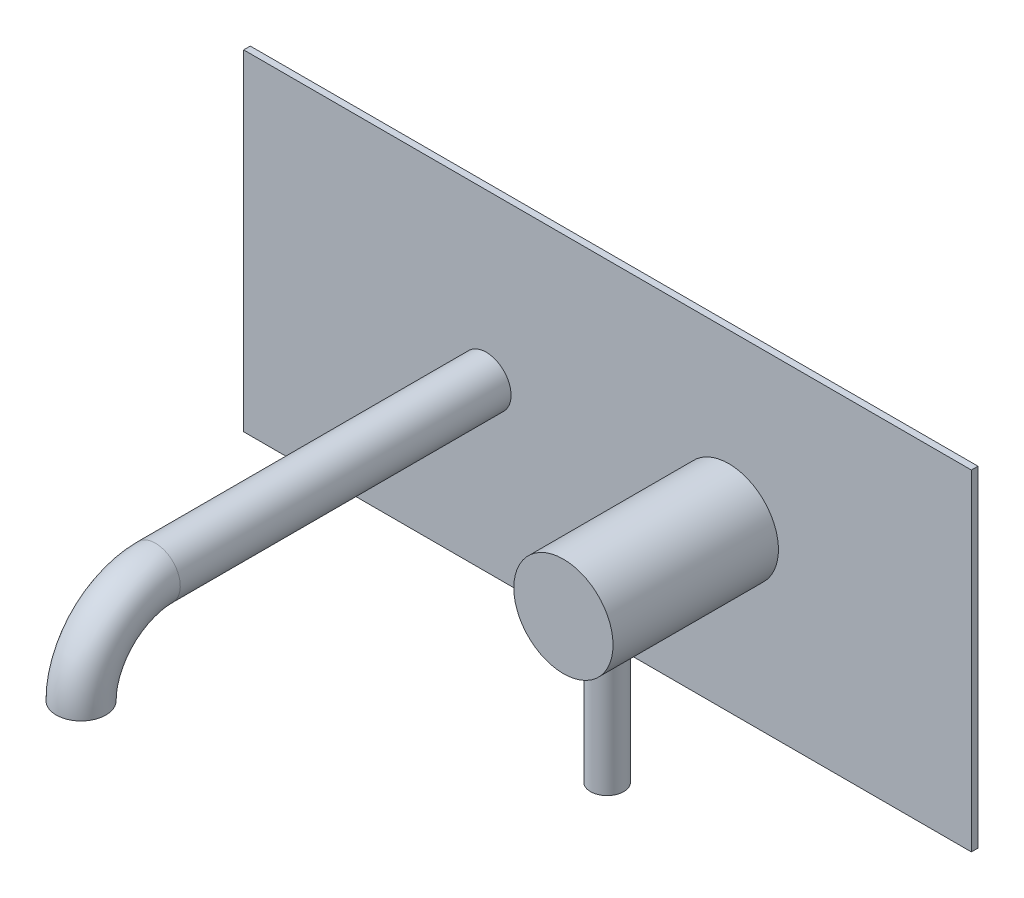
ISO-10303-21;
HEADER;
FILE_DESCRIPTION(('STEP AP214'),'2;1');
FILE_NAME('part.step','',(''),(''),'','','');
FILE_SCHEMA(('AUTOMOTIVE_DESIGN { 1 0 10303 214 1 1 1 1 }'));
ENDSEC;
DATA;
#1=APPLICATION_CONTEXT('core data for automotive mechanical design processes');
#2=APPLICATION_PROTOCOL_DEFINITION('international standard','automotive_design',2000,#1);
#3=PRODUCT_CONTEXT('',#1,'mechanical');
#4=PRODUCT('Part','Part','',(#3));
#5=PRODUCT_RELATED_PRODUCT_CATEGORY('part','',(#4));
#6=PRODUCT_DEFINITION_FORMATION('','',#4);
#7=PRODUCT_DEFINITION_CONTEXT('part definition',#1,'design');
#8=PRODUCT_DEFINITION('design','',#6,#7);
#9=PRODUCT_DEFINITION_SHAPE('','',#8);
#10=(LENGTH_UNIT() NAMED_UNIT(*) SI_UNIT(.MILLI.,.METRE.));
#11=(NAMED_UNIT(*) PLANE_ANGLE_UNIT() SI_UNIT($,.RADIAN.));
#12=(NAMED_UNIT(*) SI_UNIT($,.STERADIAN.) SOLID_ANGLE_UNIT());
#13=UNCERTAINTY_MEASURE_WITH_UNIT(LENGTH_MEASURE(1.E-05),#10,'distance_accuracy_value','');
#14=(GEOMETRIC_REPRESENTATION_CONTEXT(3) GLOBAL_UNCERTAINTY_ASSIGNED_CONTEXT((#13)) GLOBAL_UNIT_ASSIGNED_CONTEXT((#10,
#11,#12)) REPRESENTATION_CONTEXT('',''));
#15=CARTESIAN_POINT('',(0.,0.,0.));
#16=DIRECTION('',(0.,0.,1.));
#17=DIRECTION('',(1.,0.,0.));
#18=AXIS2_PLACEMENT_3D('',#15,#16,#17);
#19=CARTESIAN_POINT('',(146.666666666667,50.,52.));
#20=DIRECTION('',(0.,0.,-1.));
#21=DIRECTION('',(-1.,0.,0.));
#22=AXIS2_PLACEMENT_3D('',#19,#20,#21);
#23=CYLINDRICAL_SURFACE('',#22,15.);
#24=CARTESIAN_POINT('',(146.666666666667,50.,52.));
#25=DIRECTION('',(0.,0.,1.));
#26=DIRECTION('',(1.,0.,0.));
#27=AXIS2_PLACEMENT_3D('',#24,#25,#26);
#28=CIRCLE('',#27,15.);
#29=CARTESIAN_POINT('',(161.666666666667,50.,52.));
#30=VERTEX_POINT('',#29);
#31=EDGE_CURVE('E162',#30,#30,#28,.T.);
#32=ORIENTED_EDGE('',*,*,#31,.F.);
#33=EDGE_LOOP('',(#32));
#34=FACE_BOUND('',#33,.T.);
#35=CARTESIAN_POINT('',(146.666666666667,50.,2.));
#36=DIRECTION('',(0.,0.,-1.));
#37=DIRECTION('',(-1.,0.,0.));
#38=AXIS2_PLACEMENT_3D('',#35,#36,#37);
#39=CIRCLE('',#38,15.);
#40=CARTESIAN_POINT('',(131.666666666667,50.,2.));
#41=VERTEX_POINT('',#40);
#42=EDGE_CURVE('E66',#41,#41,#39,.F.);
#43=ORIENTED_EDGE('',*,*,#42,.T.);
#44=EDGE_LOOP('',(#43));
#45=FACE_BOUND('',#44,.T.);
#46=CARTESIAN_POINT('',(146.666666666667,35.,43.7889765907257));
#47=CARTESIAN_POINT('',(146.393849852233,34.9999992349529,43.788977859384));
#48=CARTESIAN_POINT('',(146.121040693974,35.0075115246231,43.7665752600897));
#49=CARTESIAN_POINT('',(145.583457862302,35.0367394898356,43.6778310466396));
#50=CARTESIAN_POINT('',(145.318685026072,35.058456639891,43.611484870981));
#51=CARTESIAN_POINT('',(144.805002719158,35.1137346046792,43.4373803738057));
#52=CARTESIAN_POINT('',(144.556067537237,35.1472756134623,43.3296912784299));
#53=CARTESIAN_POINT('',(144.07979198264,35.2227777141279,43.0762707265334));
#54=CARTESIAN_POINT('',(143.852455881872,35.2647404665924,42.9305317657106));
#55=CARTESIAN_POINT('',(143.417958291557,35.354295277869,42.5998475664341));
#56=CARTESIAN_POINT('',(143.211648165181,35.4020221768838,42.4138204194315));
#57=CARTESIAN_POINT('',(142.83250320315,35.4969842607708,42.0101408171848));
#58=CARTESIAN_POINT('',(142.659675739197,35.5442193351993,41.7924814160526));
#59=CARTESIAN_POINT('',(142.347541955548,35.6343333764182,41.3240510147706));
#60=CARTESIAN_POINT('',(142.209342375644,35.6770480372801,41.072507892175));
#61=CARTESIAN_POINT('',(141.977572297361,35.7512347301155,40.5480961185469));
#62=CARTESIAN_POINT('',(141.883988179754,35.7827101922071,40.2752340049472));
#63=CARTESIAN_POINT('',(141.747299359102,35.8294348362944,39.7256104832145));
#64=CARTESIAN_POINT('',(141.702599425306,35.8451952115661,39.449290548266));
#65=CARTESIAN_POINT('',(141.659961049996,35.8602171684779,38.8926578199608));
#66=CARTESIAN_POINT('',(141.66200815863,35.8594838484401,38.6123462872099));
#67=CARTESIAN_POINT('',(141.711567148163,35.8420492499946,38.0692934384646));
#68=CARTESIAN_POINT('',(141.756997100886,35.8260792081585,37.8063345760072));
#69=CARTESIAN_POINT('',(141.888635852473,35.7811671153144,37.2920094925752));
#70=CARTESIAN_POINT('',(141.974849533719,35.7522235112116,37.0406446635235));
#71=CARTESIAN_POINT('',(142.186971376349,35.6841044430152,36.5519128428061));
#72=CARTESIAN_POINT('',(142.313496423126,35.6447717102307,36.3148364633883));
#73=CARTESIAN_POINT('',(142.602221135155,35.5603720713271,35.864622049317));
#74=CARTESIAN_POINT('',(142.764431104848,35.5153035105079,35.6514909560561));
#75=CARTESIAN_POINT('',(143.129920003254,35.4216335415802,35.2435185999248));
#76=CARTESIAN_POINT('',(143.334900916285,35.3729705322491,35.0502131181812));
#77=CARTESIAN_POINT('',(143.774968816817,35.2796530806569,34.700320257408));
#78=CARTESIAN_POINT('',(144.010058688363,35.234999023099,34.5437363999031));
#79=CARTESIAN_POINT('',(144.506928601435,35.1541446031079,34.2704950895506));
#80=CARTESIAN_POINT('',(144.768950284585,35.1180324995974,34.1542491340222));
#81=CARTESIAN_POINT('',(145.310321249844,35.0589716427789,33.9679607209472));
#82=CARTESIAN_POINT('',(145.589664475892,35.0360183172562,33.8979022136086));
#83=CARTESIAN_POINT('',(146.14474751902,35.0066186464278,33.808698260614));
#84=CARTESIAN_POINT('',(146.420118667342,34.9994999083135,33.787477544862));
#85=CARTESIAN_POINT('',(146.970542016468,35.0005548652586,33.7906399587181));
#86=CARTESIAN_POINT('',(147.245594263265,35.0087259790319,33.8150153906251));
#87=CARTESIAN_POINT('',(147.779265998188,35.0389987641448,33.9070361294056));
#88=CARTESIAN_POINT('',(148.038130700841,35.0606900644404,33.9734076209732));
#89=CARTESIAN_POINT('',(148.540946459565,35.1154076584965,34.1459438130594));
#90=CARTESIAN_POINT('',(148.78489560921,35.1484353976662,34.2521135880647));
#91=CARTESIAN_POINT('',(149.258108148633,35.2235534356355,34.5043287499297));
#92=CARTESIAN_POINT('',(149.486816462752,35.2658592622107,34.6513495571416));
#93=CARTESIAN_POINT('',(149.916990817345,35.3547373041869,34.9799473407932));
#94=CARTESIAN_POINT('',(150.118448505645,35.4013108203086,35.1615348708846));
#95=CARTESIAN_POINT('',(150.497929205698,35.4961576009777,35.5638703457587));
#96=CARTESIAN_POINT('',(150.674471512895,35.5444119456286,35.78602272536));
#97=CARTESIAN_POINT('',(150.987954278285,35.6350013352645,36.2578344297802));
#98=CARTESIAN_POINT('',(151.124894406322,35.6773363308999,36.5074939838961));
#99=CARTESIAN_POINT('',(151.354651318748,35.7508804104308,37.0273416671752));
#100=CARTESIAN_POINT('',(151.447557327492,35.782111960351,37.2974869865696));
#101=CARTESIAN_POINT('',(151.586140000463,35.8294583846775,37.8508698409464));
#102=CARTESIAN_POINT('',(151.631837941436,35.845580068818,38.1341014177475));
#103=CARTESIAN_POINT('',(151.673048079053,35.8601070562911,38.6899620709303));
#104=CARTESIAN_POINT('',(151.671017953209,35.8593799871292,38.9623882921598));
#105=CARTESIAN_POINT('',(151.62287813391,35.8424365088066,39.502801965336));
#106=CARTESIAN_POINT('',(151.57677106396,35.8262210215319,39.7707896805012));
#107=CARTESIAN_POINT('',(151.443525732313,35.7807737847554,40.2896549057381));
#108=CARTESIAN_POINT('',(151.357183396744,35.7517950988761,40.5407607157482));
#109=CARTESIAN_POINT('',(151.146563495465,35.6841800590766,41.0251136254171));
#110=CARTESIAN_POINT('',(151.022277509436,35.6455415618303,41.2583567466658));
#111=CARTESIAN_POINT('',(150.732970129584,35.5608585386977,41.7113949403403));
#112=CARTESIAN_POINT('',(150.56640788049,35.5145644178931,41.9301591002177));
#113=CARTESIAN_POINT('',(150.199881082345,35.4208321858373,42.3374256576467));
#114=CARTESIAN_POINT('',(149.999907088924,35.3733937543814,42.5259194691661));
#115=CARTESIAN_POINT('',(149.56287445127,35.2804984737228,42.8746986521716));
#116=CARTESIAN_POINT('',(149.324674234165,35.2351909099372,43.0335983294807));
#117=CARTESIAN_POINT('',(148.8234534537,35.1537004413694,43.308928734979));
#118=CARTESIAN_POINT('',(148.560439257328,35.1175152046035,43.4253703203359));
#119=CARTESIAN_POINT('',(148.029134902672,35.0597242465729,43.6075847531691));
#120=CARTESIAN_POINT('',(147.761605455049,35.0375393788739,43.6753889220426));
#121=CARTESIAN_POINT('',(147.218268746718,35.0076796467889,43.7660779941114));
#122=CARTESIAN_POINT('',(146.94246379451,35.0000007734046,43.7889753082084));
#123=CARTESIAN_POINT('',(146.666666666667,35.,43.7889765907257));
#124=B_SPLINE_CURVE_WITH_KNOTS('',3,(#46,#47,#48,#49,#50,#51,#52,#53,#54,#55,#56,#57,#58,#59,
#60,#61,#62,#63,#64,#65,#66,#67,#68,#69,#70,#71,#72,#73,#74,#75,#76,#77,#78,#79,#80,#81,#82,#83,
#84,#85,#86,#87,#88,#89,#90,#91,#92,#93,#94,#95,#96,#97,#98,#99,#100,#101,#102,#103,#104,#105,
#106,#107,#108,#109,#110,#111,#112,#113,#114,#115,#116,#117,#118,#119,#120,#121,#122,#123),
.UNSPECIFIED.,.T.,.F.,(4,2,2,2,2,2,2,2,2,2,2,2,2,2,2,2,2,2,2,2,2,2,2,2,2,2,2,2,2,2,2,2,2,2,2,2,
2,2,4),(0.,0.817435530130036,1.63495592633758,2.45111336435139,3.26743188899548,
4.10923421413777,4.95122166437647,5.81741924118917,6.68335223467746,7.52009628712781,
8.35658169941007,9.1548413276371,9.95319654288057,10.764408557863,11.5758551280168,
12.4296652906748,13.2835572984374,14.1459202826243,15.0079834439669,15.8326791588649,
16.6572356583153,17.4579078990171,18.2586822643116,19.0805199922933,19.902609041201,
20.762051144144,21.6215004118563,22.4792006914449,23.3365142353984,24.1497833033193,
24.9630039676752,25.7607793541273,26.5587319089053,27.3915033346966,28.2245105562954,
29.0899830418615,29.9552340577292,30.7818279187971,31.6081933020134),.UNSPECIFIED.);
#125=CARTESIAN_POINT('',(146.666666666667,35.,43.7889765907257));
#126=VERTEX_POINT('',#125);
#127=EDGE_CURVE('E12',#126,#126,#124,.T.);
#128=ORIENTED_EDGE('',*,*,#127,.F.);
#129=EDGE_LOOP('',(#128));
#130=FACE_BOUND('',#129,.T.);
#131=ADVANCED_FACE('F51',(#34,#45,#130),#23,.T.);
#132=CARTESIAN_POINT('',(0.,0.,2.));
#133=DIRECTION('',(1.,0.,0.));
#134=DIRECTION('',(0.,0.,-1.));
#135=AXIS2_PLACEMENT_3D('',#132,#133,#134);
#136=PLANE('',#135);
#137=DIRECTION('',(0.,-1.,0.));
#138=VECTOR('',#137,1.);
#139=CARTESIAN_POINT('',(0.,0.,0.));
#140=LINE('',#139,#138);
#141=CARTESIAN_POINT('',(0.,100.,0.));
#142=VERTEX_POINT('',#141);
#143=CARTESIAN_POINT('',(0.,0.,0.));
#144=VERTEX_POINT('',#143);
#145=EDGE_CURVE('E129',#142,#144,#140,.T.);
#146=ORIENTED_EDGE('',*,*,#145,.T.);
#147=DIRECTION('',(0.,0.,-1.));
#148=VECTOR('',#147,1.);
#149=CARTESIAN_POINT('',(0.,0.,2.));
#150=LINE('',#149,#148);
#151=CARTESIAN_POINT('',(0.,0.,2.));
#152=VERTEX_POINT('',#151);
#153=EDGE_CURVE('E118',#152,#144,#150,.T.);
#154=ORIENTED_EDGE('',*,*,#153,.F.);
#155=DIRECTION('',(0.,-1.,0.));
#156=VECTOR('',#155,1.);
#157=CARTESIAN_POINT('',(0.,0.,2.));
#158=LINE('',#157,#156);
#159=CARTESIAN_POINT('',(0.,100.,2.));
#160=VERTEX_POINT('',#159);
#161=EDGE_CURVE('E110',#160,#152,#158,.T.);
#162=ORIENTED_EDGE('',*,*,#161,.F.);
#163=DIRECTION('',(0.,0.,-1.));
#164=VECTOR('',#163,1.);
#165=CARTESIAN_POINT('',(0.,100.,2.));
#166=LINE('',#165,#164);
#167=EDGE_CURVE('E125',#160,#142,#166,.T.);
#168=ORIENTED_EDGE('',*,*,#167,.T.);
#169=EDGE_LOOP('',(#146,#154,#162,#168));
#170=FACE_BOUND('',#169,.T.);
#171=ADVANCED_FACE('F53',(#170),#136,.F.);
#172=CARTESIAN_POINT('',(0.,0.,2.));
#173=DIRECTION('',(0.,1.,0.));
#174=DIRECTION('',(0.,0.,1.));
#175=AXIS2_PLACEMENT_3D('',#172,#173,#174);
#176=PLANE('',#175);
#177=DIRECTION('',(1.,0.,0.));
#178=VECTOR('',#177,1.);
#179=CARTESIAN_POINT('',(0.,0.,0.));
#180=LINE('',#179,#178);
#181=CARTESIAN_POINT('',(220.,0.,0.));
#182=VERTEX_POINT('',#181);
#183=EDGE_CURVE('E116',#144,#182,#180,.T.);
#184=ORIENTED_EDGE('',*,*,#183,.T.);
#185=DIRECTION('',(0.,0.,-1.));
#186=VECTOR('',#185,1.);
#187=CARTESIAN_POINT('',(220.,0.,2.));
#188=LINE('',#187,#186);
#189=CARTESIAN_POINT('',(220.,0.,2.));
#190=VERTEX_POINT('',#189);
#191=EDGE_CURVE('E114',#190,#182,#188,.T.);
#192=ORIENTED_EDGE('',*,*,#191,.F.);
#193=DIRECTION('',(1.,0.,0.));
#194=VECTOR('',#193,1.);
#195=CARTESIAN_POINT('',(0.,0.,2.));
#196=LINE('',#195,#194);
#197=EDGE_CURVE('E105',#152,#190,#196,.T.);
#198=ORIENTED_EDGE('',*,*,#197,.F.);
#199=ORIENTED_EDGE('',*,*,#153,.T.);
#200=EDGE_LOOP('',(#184,#192,#198,#199));
#201=FACE_BOUND('',#200,.T.);
#202=ADVANCED_FACE('F115',(#201),#176,.F.);
#203=CARTESIAN_POINT('',(220.,0.,2.));
#204=DIRECTION('',(-1.,0.,0.));
#205=DIRECTION('',(0.,0.,1.));
#206=AXIS2_PLACEMENT_3D('',#203,#204,#205);
#207=PLANE('',#206);
#208=DIRECTION('',(0.,1.,0.));
#209=VECTOR('',#208,1.);
#210=CARTESIAN_POINT('',(220.,0.,0.));
#211=LINE('',#210,#209);
#212=CARTESIAN_POINT('',(220.,100.,0.));
#213=VERTEX_POINT('',#212);
#214=EDGE_CURVE('E91',#182,#213,#211,.T.);
#215=ORIENTED_EDGE('',*,*,#214,.T.);
#216=DIRECTION('',(0.,0.,-1.));
#217=VECTOR('',#216,1.);
#218=CARTESIAN_POINT('',(220.,100.,2.));
#219=LINE('',#218,#217);
#220=CARTESIAN_POINT('',(220.,100.,2.));
#221=VERTEX_POINT('',#220);
#222=EDGE_CURVE('E119',#221,#213,#219,.T.);
#223=ORIENTED_EDGE('',*,*,#222,.F.);
#224=DIRECTION('',(0.,1.,0.));
#225=VECTOR('',#224,1.);
#226=CARTESIAN_POINT('',(220.,0.,2.));
#227=LINE('',#226,#225);
#228=EDGE_CURVE('E108',#190,#221,#227,.T.);
#229=ORIENTED_EDGE('',*,*,#228,.F.);
#230=ORIENTED_EDGE('',*,*,#191,.T.);
#231=EDGE_LOOP('',(#215,#223,#229,#230));
#232=FACE_BOUND('',#231,.T.);
#233=ADVANCED_FACE('F121',(#232),#207,.F.);
#234=CARTESIAN_POINT('',(0.,100.,2.));
#235=DIRECTION('',(0.,-1.,0.));
#236=DIRECTION('',(0.,0.,-1.));
#237=AXIS2_PLACEMENT_3D('',#234,#235,#236);
#238=PLANE('',#237);
#239=DIRECTION('',(-1.,0.,0.));
#240=VECTOR('',#239,1.);
#241=CARTESIAN_POINT('',(0.,100.,0.));
#242=LINE('',#241,#240);
#243=EDGE_CURVE('E97',#213,#142,#242,.T.);
#244=ORIENTED_EDGE('',*,*,#243,.T.);
#245=ORIENTED_EDGE('',*,*,#167,.F.);
#246=DIRECTION('',(-1.,0.,0.));
#247=VECTOR('',#246,1.);
#248=CARTESIAN_POINT('',(0.,100.,2.));
#249=LINE('',#248,#247);
#250=EDGE_CURVE('E74',#221,#160,#249,.T.);
#251=ORIENTED_EDGE('',*,*,#250,.F.);
#252=ORIENTED_EDGE('',*,*,#222,.T.);
#253=EDGE_LOOP('',(#244,#245,#251,#252));
#254=FACE_BOUND('',#253,.T.);
#255=ADVANCED_FACE('F154',(#254),#238,.F.);
#256=CARTESIAN_POINT('',(0.,0.,2.));
#257=DIRECTION('',(0.,0.,-1.));
#258=DIRECTION('',(-1.,0.,0.));
#259=AXIS2_PLACEMENT_3D('',#256,#257,#258);
#260=PLANE('',#259);
#261=ORIENTED_EDGE('',*,*,#42,.F.);
#262=EDGE_LOOP('',(#261));
#263=FACE_BOUND('',#262,.T.);
#264=CARTESIAN_POINT('',(73.3333333333333,50.,2.00000000000005));
#265=DIRECTION('',(0.,0.,-1.));
#266=DIRECTION('',(0.,1.,0.));
#267=AXIS2_PLACEMENT_3D('',#264,#265,#266);
#268=CIRCLE('',#267,7.50000000000001);
#269=CARTESIAN_POINT('',(73.3333333333333,57.5,2.00000000000004));
#270=VERTEX_POINT('',#269);
#271=EDGE_CURVE('E158',#270,#270,#268,.T.);
#272=ORIENTED_EDGE('',*,*,#271,.T.);
#273=EDGE_LOOP('',(#272));
#274=FACE_BOUND('',#273,.T.);
#275=ORIENTED_EDGE('',*,*,#161,.T.);
#276=ORIENTED_EDGE('',*,*,#197,.T.);
#277=ORIENTED_EDGE('',*,*,#228,.T.);
#278=ORIENTED_EDGE('',*,*,#250,.T.);
#279=EDGE_LOOP('',(#275,#276,#277,#278));
#280=FACE_BOUND('',#279,.T.);
#281=ADVANCED_FACE('F106',(#263,#274,#280),#260,.F.);
#282=CARTESIAN_POINT('',(0.,0.,0.));
#283=DIRECTION('',(0.,0.,-1.));
#284=DIRECTION('',(-1.,0.,0.));
#285=AXIS2_PLACEMENT_3D('',#282,#283,#284);
#286=PLANE('',#285);
#287=ORIENTED_EDGE('',*,*,#145,.F.);
#288=ORIENTED_EDGE('',*,*,#243,.F.);
#289=ORIENTED_EDGE('',*,*,#214,.F.);
#290=ORIENTED_EDGE('',*,*,#183,.F.);
#291=EDGE_LOOP('',(#287,#288,#289,#290));
#292=FACE_BOUND('',#291,.T.);
#293=ADVANCED_FACE('F153',(#292),#286,.T.);
#294=CARTESIAN_POINT('',(73.3333333333333,27.5,124.5));
#295=DIRECTION('',(0.,1.,0.));
#296=DIRECTION('',(0.,0.,1.));
#297=AXIS2_PLACEMENT_3D('',#294,#295,#296);
#298=PLANE('',#297);
#299=CARTESIAN_POINT('',(73.3333333333333,27.5,124.5));
#300=DIRECTION('',(0.,1.,0.));
#301=DIRECTION('',(0.,0.,1.));
#302=AXIS2_PLACEMENT_3D('',#299,#300,#301);
#303=CIRCLE('',#302,7.50000000000001);
#304=CARTESIAN_POINT('',(73.3333333333333,27.5,132.));
#305=VERTEX_POINT('',#304);
#306=EDGE_CURVE('E133',#305,#305,#303,.T.);
#307=ORIENTED_EDGE('',*,*,#306,.F.);
#308=EDGE_LOOP('',(#307));
#309=FACE_BOUND('',#308,.T.);
#310=ADVANCED_FACE('F181',(#309),#298,.F.);
#311=CARTESIAN_POINT('',(73.3333333333333,50.,2.00000000000005));
#312=DIRECTION('',(0.,0.,1.));
#313=DIRECTION('',(1.,0.,0.));
#314=AXIS2_PLACEMENT_3D('',#311,#312,#313);
#315=CYLINDRICAL_SURFACE('',#314,7.50000000000001);
#316=CARTESIAN_POINT('',(73.3333333333333,50.,102.));
#317=DIRECTION('',(0.,0.,-1.));
#318=DIRECTION('',(0.,1.,0.));
#319=AXIS2_PLACEMENT_3D('',#316,#317,#318);
#320=CIRCLE('',#319,7.50000000000001);
#321=CARTESIAN_POINT('',(73.3333333333333,57.5,102.));
#322=VERTEX_POINT('',#321);
#323=EDGE_CURVE('E161',#322,#322,#320,.T.);
#324=ORIENTED_EDGE('',*,*,#323,.T.);
#325=EDGE_LOOP('',(#324));
#326=FACE_BOUND('',#325,.T.);
#327=ORIENTED_EDGE('',*,*,#271,.F.);
#328=EDGE_LOOP('',(#327));
#329=FACE_BOUND('',#328,.T.);
#330=ADVANCED_FACE('F183',(#326,#329),#315,.T.);
#331=CARTESIAN_POINT('',(73.3333333333333,27.5,102.));
#332=DIRECTION('',(1.,0.,0.));
#333=DIRECTION('',(0.,0.,-1.));
#334=AXIS2_PLACEMENT_3D('',#331,#332,#333);
#335=TOROIDAL_SURFACE('',#334,22.5,7.50000000000001);
#336=CARTESIAN_POINT('',(73.3333333333333,27.5,102.));
#337=DIRECTION('',(1.,0.,0.));
#338=DIRECTION('',(0.,0.,-1.));
#339=AXIS2_PLACEMENT_3D('',#336,#337,#338);
#340=CIRCLE('',#339,30.);
#341=EDGE_CURVE('',#322,#305,#340,.T.);
#342=ORIENTED_EDGE('',*,*,#323,.F.);
#343=ORIENTED_EDGE('',*,*,#306,.T.);
#344=ORIENTED_EDGE('',*,*,#341,.T.);
#345=ORIENTED_EDGE('',*,*,#341,.F.);
#346=EDGE_LOOP('',(#342,#344,#343,#345));
#347=FACE_BOUND('',#346,.T.);
#348=ADVANCED_FACE('F178',(#347),#335,.T.);
#349=CARTESIAN_POINT('',(146.666666666667,50.,52.));
#350=DIRECTION('',(0.,0.,1.));
#351=DIRECTION('',(1.,0.,0.));
#352=AXIS2_PLACEMENT_3D('',#349,#350,#351);
#353=PLANE('',#352);
#354=ORIENTED_EDGE('',*,*,#31,.T.);
#355=EDGE_LOOP('',(#354));
#356=FACE_BOUND('',#355,.T.);
#357=ADVANCED_FACE('F185',(#356),#353,.T.);
#358=CARTESIAN_POINT('',(146.666666666667,0.,38.7889765907258));
#359=DIRECTION('',(0.,1.,0.));
#360=DIRECTION('',(0.,0.,1.));
#361=AXIS2_PLACEMENT_3D('',#358,#359,#360);
#362=CYLINDRICAL_SURFACE('',#361,4.99999999999999);
#363=CARTESIAN_POINT('',(146.666666666667,0.,38.7889765907258));
#364=DIRECTION('',(0.,-1.,0.));
#365=DIRECTION('',(0.,0.,-1.));
#366=AXIS2_PLACEMENT_3D('',#363,#364,#365);
#367=CIRCLE('',#366,4.99999999999999);
#368=CARTESIAN_POINT('',(146.666666666667,0.,33.7889765907258));
#369=VERTEX_POINT('',#368);
#370=EDGE_CURVE('E169',#369,#369,#367,.T.);
#371=ORIENTED_EDGE('',*,*,#370,.F.);
#372=EDGE_LOOP('',(#371));
#373=FACE_BOUND('',#372,.T.);
#374=ORIENTED_EDGE('',*,*,#127,.T.);
#375=EDGE_LOOP('',(#374));
#376=FACE_BOUND('',#375,.T.);
#377=ADVANCED_FACE('F196',(#373,#376),#362,.T.);
#378=CARTESIAN_POINT('',(146.666666666667,0.,38.7889765907258));
#379=DIRECTION('',(0.,-1.,0.));
#380=DIRECTION('',(0.,0.,-1.));
#381=AXIS2_PLACEMENT_3D('',#378,#379,#380);
#382=PLANE('',#381);
#383=ORIENTED_EDGE('',*,*,#370,.T.);
#384=EDGE_LOOP('',(#383));
#385=FACE_BOUND('',#384,.T.);
#386=ADVANCED_FACE('F223',(#385),#382,.T.);
#387=CLOSED_SHELL('',(#131,#171,#202,#233,#255,#281,#293,#310,#330,#348,#357,#377,#386));
#388=MANIFOLD_SOLID_BREP('B2',#387);
#389=ADVANCED_BREP_SHAPE_REPRESENTATION('',(#18,#388),#14);
#390=SHAPE_DEFINITION_REPRESENTATION(#9,#389);
ENDSEC;
END-ISO-10303-21;
